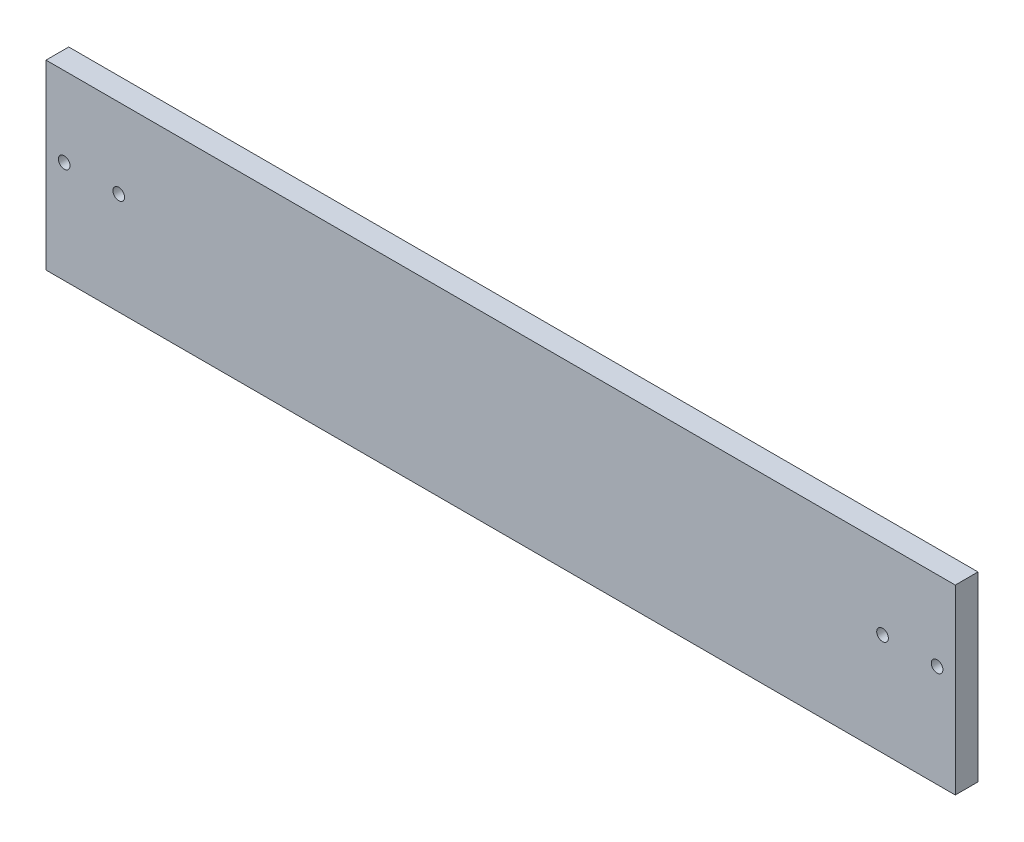
ISO-10303-21;
HEADER;
FILE_DESCRIPTION(('STEP AP214'),'2;1');
FILE_NAME('part.step','',(''),(''),'','','');
FILE_SCHEMA(('AUTOMOTIVE_DESIGN { 1 0 10303 214 1 1 1 1 }'));
ENDSEC;
DATA;
#1=APPLICATION_CONTEXT('core data for automotive mechanical design processes');
#2=APPLICATION_PROTOCOL_DEFINITION('international standard','automotive_design',2000,#1);
#3=PRODUCT_CONTEXT('',#1,'mechanical');
#4=PRODUCT('Part','Part','',(#3));
#5=PRODUCT_RELATED_PRODUCT_CATEGORY('part','',(#4));
#6=PRODUCT_DEFINITION_FORMATION('','',#4);
#7=PRODUCT_DEFINITION_CONTEXT('part definition',#1,'design');
#8=PRODUCT_DEFINITION('design','',#6,#7);
#9=PRODUCT_DEFINITION_SHAPE('','',#8);
#10=(LENGTH_UNIT() NAMED_UNIT(*) SI_UNIT(.MILLI.,.METRE.));
#11=(NAMED_UNIT(*) PLANE_ANGLE_UNIT() SI_UNIT($,.RADIAN.));
#12=(NAMED_UNIT(*) SI_UNIT($,.STERADIAN.) SOLID_ANGLE_UNIT());
#13=UNCERTAINTY_MEASURE_WITH_UNIT(LENGTH_MEASURE(1.E-05),#10,'distance_accuracy_value','');
#14=(GEOMETRIC_REPRESENTATION_CONTEXT(3) GLOBAL_UNCERTAINTY_ASSIGNED_CONTEXT((#13)) GLOBAL_UNIT_ASSIGNED_CONTEXT((#10,
#11,#12)) REPRESENTATION_CONTEXT('',''));
#15=CARTESIAN_POINT('',(0.,0.,0.));
#16=DIRECTION('',(0.,0.,1.));
#17=DIRECTION('',(1.,0.,0.));
#18=AXIS2_PLACEMENT_3D('',#15,#16,#17);
#19=CARTESIAN_POINT('',(127.,25.4,6.35));
#20=DIRECTION('',(-1.,0.,0.));
#21=DIRECTION('',(0.,0.,1.));
#22=AXIS2_PLACEMENT_3D('',#19,#20,#21);
#23=PLANE('',#22);
#24=DIRECTION('',(0.,1.,0.));
#25=VECTOR('',#24,1.);
#26=CARTESIAN_POINT('',(127.,25.4,0.));
#27=LINE('',#26,#25);
#28=CARTESIAN_POINT('',(127.,-25.4,0.));
#29=VERTEX_POINT('',#28);
#30=CARTESIAN_POINT('',(127.,25.4,0.));
#31=VERTEX_POINT('',#30);
#32=EDGE_CURVE('E113',#29,#31,#27,.T.);
#33=ORIENTED_EDGE('',*,*,#32,.T.);
#34=DIRECTION('',(0.,0.,-1.));
#35=VECTOR('',#34,1.);
#36=CARTESIAN_POINT('',(127.,25.4,6.35));
#37=LINE('',#36,#35);
#38=CARTESIAN_POINT('',(127.,25.4,6.35));
#39=VERTEX_POINT('',#38);
#40=EDGE_CURVE('E11',#39,#31,#37,.T.);
#41=ORIENTED_EDGE('',*,*,#40,.F.);
#42=DIRECTION('',(0.,1.,0.));
#43=VECTOR('',#42,1.);
#44=CARTESIAN_POINT('',(127.,25.4,6.35));
#45=LINE('',#44,#43);
#46=CARTESIAN_POINT('',(127.,-25.4,6.35));
#47=VERTEX_POINT('',#46);
#48=EDGE_CURVE('E97',#47,#39,#45,.T.);
#49=ORIENTED_EDGE('',*,*,#48,.F.);
#50=DIRECTION('',(0.,0.,-1.));
#51=VECTOR('',#50,1.);
#52=CARTESIAN_POINT('',(127.,-25.4,6.35));
#53=LINE('',#52,#51);
#54=EDGE_CURVE('E107',#47,#29,#53,.T.);
#55=ORIENTED_EDGE('',*,*,#54,.T.);
#56=EDGE_LOOP('',(#33,#41,#49,#55));
#57=FACE_BOUND('',#56,.T.);
#58=ADVANCED_FACE('F44',(#57),#23,.F.);
#59=CARTESIAN_POINT('',(-127.,25.4,6.35));
#60=DIRECTION('',(0.,-1.,0.));
#61=DIRECTION('',(0.,0.,-1.));
#62=AXIS2_PLACEMENT_3D('',#59,#60,#61);
#63=PLANE('',#62);
#64=DIRECTION('',(-1.,0.,0.));
#65=VECTOR('',#64,1.);
#66=CARTESIAN_POINT('',(-127.,25.4,0.));
#67=LINE('',#66,#65);
#68=CARTESIAN_POINT('',(-127.,25.4,0.));
#69=VERTEX_POINT('',#68);
#70=EDGE_CURVE('E105',#31,#69,#67,.T.);
#71=ORIENTED_EDGE('',*,*,#70,.T.);
#72=DIRECTION('',(0.,0.,-1.));
#73=VECTOR('',#72,1.);
#74=CARTESIAN_POINT('',(-127.,25.4,6.35));
#75=LINE('',#74,#73);
#76=CARTESIAN_POINT('',(-127.,25.4,6.35));
#77=VERTEX_POINT('',#76);
#78=EDGE_CURVE('E53',#77,#69,#75,.T.);
#79=ORIENTED_EDGE('',*,*,#78,.F.);
#80=DIRECTION('',(-1.,0.,0.));
#81=VECTOR('',#80,1.);
#82=CARTESIAN_POINT('',(-127.,25.4,6.35));
#83=LINE('',#82,#81);
#84=EDGE_CURVE('E91',#39,#77,#83,.T.);
#85=ORIENTED_EDGE('',*,*,#84,.F.);
#86=ORIENTED_EDGE('',*,*,#40,.T.);
#87=EDGE_LOOP('',(#71,#79,#85,#86));
#88=FACE_BOUND('',#87,.T.);
#89=ADVANCED_FACE('F103',(#88),#63,.F.);
#90=CARTESIAN_POINT('',(-127.,25.4,6.35));
#91=DIRECTION('',(1.,0.,0.));
#92=DIRECTION('',(0.,0.,-1.));
#93=AXIS2_PLACEMENT_3D('',#90,#91,#92);
#94=PLANE('',#93);
#95=DIRECTION('',(0.,-1.,0.));
#96=VECTOR('',#95,1.);
#97=CARTESIAN_POINT('',(-127.,25.4,0.));
#98=LINE('',#97,#96);
#99=CARTESIAN_POINT('',(-127.,-25.4,0.));
#100=VERTEX_POINT('',#99);
#101=EDGE_CURVE('E79',#69,#100,#98,.T.);
#102=ORIENTED_EDGE('',*,*,#101,.T.);
#103=DIRECTION('',(0.,0.,-1.));
#104=VECTOR('',#103,1.);
#105=CARTESIAN_POINT('',(-127.,-25.4,6.35));
#106=LINE('',#105,#104);
#107=CARTESIAN_POINT('',(-127.,-25.4,6.35));
#108=VERTEX_POINT('',#107);
#109=EDGE_CURVE('E104',#108,#100,#106,.T.);
#110=ORIENTED_EDGE('',*,*,#109,.F.);
#111=DIRECTION('',(0.,-1.,0.));
#112=VECTOR('',#111,1.);
#113=CARTESIAN_POINT('',(-127.,25.4,6.35));
#114=LINE('',#113,#112);
#115=EDGE_CURVE('E92',#77,#108,#114,.T.);
#116=ORIENTED_EDGE('',*,*,#115,.F.);
#117=ORIENTED_EDGE('',*,*,#78,.T.);
#118=EDGE_LOOP('',(#102,#110,#116,#117));
#119=FACE_BOUND('',#118,.T.);
#120=ADVANCED_FACE('F102',(#119),#94,.F.);
#121=CARTESIAN_POINT('',(-127.,-25.4,6.35));
#122=DIRECTION('',(0.,1.,0.));
#123=DIRECTION('',(0.,0.,1.));
#124=AXIS2_PLACEMENT_3D('',#121,#122,#123);
#125=PLANE('',#124);
#126=DIRECTION('',(1.,0.,0.));
#127=VECTOR('',#126,1.);
#128=CARTESIAN_POINT('',(-127.,-25.4,0.));
#129=LINE('',#128,#127);
#130=EDGE_CURVE('E83',#100,#29,#129,.T.);
#131=ORIENTED_EDGE('',*,*,#130,.T.);
#132=ORIENTED_EDGE('',*,*,#54,.F.);
#133=DIRECTION('',(1.,0.,0.));
#134=VECTOR('',#133,1.);
#135=CARTESIAN_POINT('',(-127.,-25.4,6.35));
#136=LINE('',#135,#134);
#137=EDGE_CURVE('E65',#108,#47,#136,.T.);
#138=ORIENTED_EDGE('',*,*,#137,.F.);
#139=ORIENTED_EDGE('',*,*,#109,.T.);
#140=EDGE_LOOP('',(#131,#132,#138,#139));
#141=FACE_BOUND('',#140,.T.);
#142=ADVANCED_FACE('F130',(#141),#125,.F.);
#143=CARTESIAN_POINT('',(0.,0.,6.35));
#144=DIRECTION('',(0.,0.,1.));
#145=DIRECTION('',(1.,0.,0.));
#146=AXIS2_PLACEMENT_3D('',#143,#144,#145);
#147=PLANE('',#146);
#148=CARTESIAN_POINT('',(106.68,3.175,6.35));
#149=DIRECTION('',(0.,0.,1.));
#150=DIRECTION('',(1.,0.,0.));
#151=AXIS2_PLACEMENT_3D('',#148,#149,#150);
#152=CIRCLE('',#151,1.62559999999999);
#153=CARTESIAN_POINT('',(108.3056,3.175,6.35));
#154=VERTEX_POINT('',#153);
#155=EDGE_CURVE('E163',#154,#154,#152,.T.);
#156=ORIENTED_EDGE('',*,*,#155,.F.);
#157=EDGE_LOOP('',(#156));
#158=FACE_BOUND('',#157,.T.);
#159=CARTESIAN_POINT('',(121.92,3.175,6.35));
#160=DIRECTION('',(0.,0.,1.));
#161=DIRECTION('',(1.,0.,0.));
#162=AXIS2_PLACEMENT_3D('',#159,#160,#161);
#163=CIRCLE('',#162,1.62559999999999);
#164=CARTESIAN_POINT('',(123.5456,3.175,6.35));
#165=VERTEX_POINT('',#164);
#166=EDGE_CURVE('E152',#165,#165,#163,.T.);
#167=ORIENTED_EDGE('',*,*,#166,.F.);
#168=EDGE_LOOP('',(#167));
#169=FACE_BOUND('',#168,.T.);
#170=CARTESIAN_POINT('',(-106.68,3.175,6.35));
#171=DIRECTION('',(0.,0.,1.));
#172=DIRECTION('',(1.,0.,0.));
#173=AXIS2_PLACEMENT_3D('',#170,#171,#172);
#174=CIRCLE('',#173,1.6256);
#175=CARTESIAN_POINT('',(-105.0544,3.175,6.35));
#176=VERTEX_POINT('',#175);
#177=EDGE_CURVE('E143',#176,#176,#174,.T.);
#178=ORIENTED_EDGE('',*,*,#177,.F.);
#179=EDGE_LOOP('',(#178));
#180=FACE_BOUND('',#179,.T.);
#181=CARTESIAN_POINT('',(-121.92,3.175,6.35));
#182=DIRECTION('',(0.,0.,1.));
#183=DIRECTION('',(1.,0.,0.));
#184=AXIS2_PLACEMENT_3D('',#181,#182,#183);
#185=CIRCLE('',#184,1.6256);
#186=CARTESIAN_POINT('',(-120.2944,3.175,6.35));
#187=VERTEX_POINT('',#186);
#188=EDGE_CURVE('E136',#187,#187,#185,.T.);
#189=ORIENTED_EDGE('',*,*,#188,.F.);
#190=EDGE_LOOP('',(#189));
#191=FACE_BOUND('',#190,.T.);
#192=ORIENTED_EDGE('',*,*,#48,.T.);
#193=ORIENTED_EDGE('',*,*,#84,.T.);
#194=ORIENTED_EDGE('',*,*,#115,.T.);
#195=ORIENTED_EDGE('',*,*,#137,.T.);
#196=EDGE_LOOP('',(#192,#193,#194,#195));
#197=FACE_BOUND('',#196,.T.);
#198=ADVANCED_FACE('F95',(#158,#169,#180,#191,#197),#147,.T.);
#199=CARTESIAN_POINT('',(0.,0.,0.));
#200=DIRECTION('',(0.,0.,1.));
#201=DIRECTION('',(1.,0.,0.));
#202=AXIS2_PLACEMENT_3D('',#199,#200,#201);
#203=PLANE('',#202);
#204=CARTESIAN_POINT('',(106.68,3.175,0.));
#205=DIRECTION('',(0.,0.,1.));
#206=DIRECTION('',(1.,0.,0.));
#207=AXIS2_PLACEMENT_3D('',#204,#205,#206);
#208=CIRCLE('',#207,1.62559999999999);
#209=CARTESIAN_POINT('',(108.3056,3.175,0.));
#210=VERTEX_POINT('',#209);
#211=EDGE_CURVE('E156',#210,#210,#208,.T.);
#212=ORIENTED_EDGE('',*,*,#211,.T.);
#213=EDGE_LOOP('',(#212));
#214=FACE_BOUND('',#213,.T.);
#215=CARTESIAN_POINT('',(121.92,3.175,0.));
#216=DIRECTION('',(0.,0.,1.));
#217=DIRECTION('',(1.,0.,0.));
#218=AXIS2_PLACEMENT_3D('',#215,#216,#217);
#219=CIRCLE('',#218,1.62559999999999);
#220=CARTESIAN_POINT('',(123.5456,3.175,0.));
#221=VERTEX_POINT('',#220);
#222=EDGE_CURVE('E146',#221,#221,#219,.T.);
#223=ORIENTED_EDGE('',*,*,#222,.T.);
#224=EDGE_LOOP('',(#223));
#225=FACE_BOUND('',#224,.T.);
#226=CARTESIAN_POINT('',(-106.68,3.175,0.));
#227=DIRECTION('',(0.,0.,1.));
#228=DIRECTION('',(1.,0.,0.));
#229=AXIS2_PLACEMENT_3D('',#226,#227,#228);
#230=CIRCLE('',#229,1.6256);
#231=CARTESIAN_POINT('',(-105.0544,3.175,0.));
#232=VERTEX_POINT('',#231);
#233=EDGE_CURVE('E142',#232,#232,#230,.T.);
#234=ORIENTED_EDGE('',*,*,#233,.T.);
#235=EDGE_LOOP('',(#234));
#236=FACE_BOUND('',#235,.T.);
#237=CARTESIAN_POINT('',(-121.92,3.175,0.));
#238=DIRECTION('',(0.,0.,1.));
#239=DIRECTION('',(1.,0.,0.));
#240=AXIS2_PLACEMENT_3D('',#237,#238,#239);
#241=CIRCLE('',#240,1.6256);
#242=CARTESIAN_POINT('',(-120.2944,3.175,0.));
#243=VERTEX_POINT('',#242);
#244=EDGE_CURVE('E120',#243,#243,#241,.T.);
#245=ORIENTED_EDGE('',*,*,#244,.T.);
#246=EDGE_LOOP('',(#245));
#247=FACE_BOUND('',#246,.T.);
#248=ORIENTED_EDGE('',*,*,#32,.F.);
#249=ORIENTED_EDGE('',*,*,#130,.F.);
#250=ORIENTED_EDGE('',*,*,#101,.F.);
#251=ORIENTED_EDGE('',*,*,#70,.F.);
#252=EDGE_LOOP('',(#248,#249,#250,#251));
#253=FACE_BOUND('',#252,.T.);
#254=ADVANCED_FACE('F128',(#214,#225,#236,#247,#253),#203,.F.);
#255=CARTESIAN_POINT('',(-121.92,3.175,6.35));
#256=DIRECTION('',(0.,0.,1.));
#257=DIRECTION('',(1.,0.,0.));
#258=AXIS2_PLACEMENT_3D('',#255,#256,#257);
#259=CYLINDRICAL_SURFACE('',#258,1.6256);
#260=ORIENTED_EDGE('',*,*,#244,.F.);
#261=EDGE_LOOP('',(#260));
#262=FACE_BOUND('',#261,.T.);
#263=ORIENTED_EDGE('',*,*,#188,.T.);
#264=EDGE_LOOP('',(#263));
#265=FACE_BOUND('',#264,.T.);
#266=ADVANCED_FACE('F180',(#262,#265),#259,.F.);
#267=CARTESIAN_POINT('',(-106.68,3.175,6.35));
#268=DIRECTION('',(0.,0.,1.));
#269=DIRECTION('',(1.,0.,0.));
#270=AXIS2_PLACEMENT_3D('',#267,#268,#269);
#271=CYLINDRICAL_SURFACE('',#270,1.6256);
#272=ORIENTED_EDGE('',*,*,#233,.F.);
#273=EDGE_LOOP('',(#272));
#274=FACE_BOUND('',#273,.T.);
#275=ORIENTED_EDGE('',*,*,#177,.T.);
#276=EDGE_LOOP('',(#275));
#277=FACE_BOUND('',#276,.T.);
#278=ADVANCED_FACE('F177',(#274,#277),#271,.F.);
#279=CARTESIAN_POINT('',(121.92,3.175,6.35));
#280=DIRECTION('',(0.,0.,1.));
#281=DIRECTION('',(1.,0.,0.));
#282=AXIS2_PLACEMENT_3D('',#279,#280,#281);
#283=CYLINDRICAL_SURFACE('',#282,1.62559999999999);
#284=ORIENTED_EDGE('',*,*,#222,.F.);
#285=EDGE_LOOP('',(#284));
#286=FACE_BOUND('',#285,.T.);
#287=ORIENTED_EDGE('',*,*,#166,.T.);
#288=EDGE_LOOP('',(#287));
#289=FACE_BOUND('',#288,.T.);
#290=ADVANCED_FACE('F187',(#286,#289),#283,.F.);
#291=CARTESIAN_POINT('',(106.68,3.175,6.35));
#292=DIRECTION('',(0.,0.,1.));
#293=DIRECTION('',(1.,0.,0.));
#294=AXIS2_PLACEMENT_3D('',#291,#292,#293);
#295=CYLINDRICAL_SURFACE('',#294,1.62559999999999);
#296=ORIENTED_EDGE('',*,*,#211,.F.);
#297=EDGE_LOOP('',(#296));
#298=FACE_BOUND('',#297,.T.);
#299=ORIENTED_EDGE('',*,*,#155,.T.);
#300=EDGE_LOOP('',(#299));
#301=FACE_BOUND('',#300,.T.);
#302=ADVANCED_FACE('F168',(#298,#301),#295,.F.);
#303=CLOSED_SHELL('',(#58,#89,#120,#142,#198,#254,#266,#278,#290,#302));
#304=MANIFOLD_SOLID_BREP('B2',#303);
#305=ADVANCED_BREP_SHAPE_REPRESENTATION('',(#18,#304),#14);
#306=SHAPE_DEFINITION_REPRESENTATION(#9,#305);
ENDSEC;
END-ISO-10303-21;
